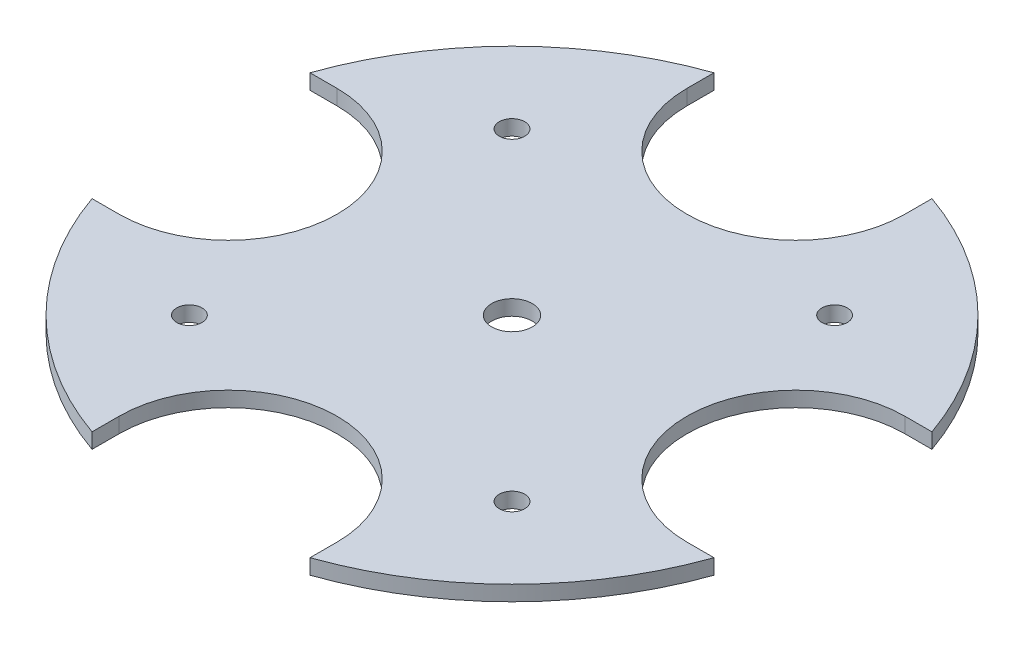
ISO-10303-21;
HEADER;
FILE_DESCRIPTION(('STEP AP214'),'2;1');
FILE_NAME('part.step','',(''),(''),'','','');
FILE_SCHEMA(('AUTOMOTIVE_DESIGN { 1 0 10303 214 1 1 1 1 }'));
ENDSEC;
DATA;
#1=APPLICATION_CONTEXT('core data for automotive mechanical design processes');
#2=APPLICATION_PROTOCOL_DEFINITION('international standard','automotive_design',2000,#1);
#3=PRODUCT_CONTEXT('',#1,'mechanical');
#4=PRODUCT('Part','Part','',(#3));
#5=PRODUCT_RELATED_PRODUCT_CATEGORY('part','',(#4));
#6=PRODUCT_DEFINITION_FORMATION('','',#4);
#7=PRODUCT_DEFINITION_CONTEXT('part definition',#1,'design');
#8=PRODUCT_DEFINITION('design','',#6,#7);
#9=PRODUCT_DEFINITION_SHAPE('','',#8);
#10=(LENGTH_UNIT() NAMED_UNIT(*) SI_UNIT(.MILLI.,.METRE.));
#11=(NAMED_UNIT(*) PLANE_ANGLE_UNIT() SI_UNIT($,.RADIAN.));
#12=(NAMED_UNIT(*) SI_UNIT($,.STERADIAN.) SOLID_ANGLE_UNIT());
#13=UNCERTAINTY_MEASURE_WITH_UNIT(LENGTH_MEASURE(1.E-05),#10,'distance_accuracy_value','');
#14=(GEOMETRIC_REPRESENTATION_CONTEXT(3) GLOBAL_UNCERTAINTY_ASSIGNED_CONTEXT((#13)) GLOBAL_UNIT_ASSIGNED_CONTEXT((#10,
#11,#12)) REPRESENTATION_CONTEXT('',''));
#15=CARTESIAN_POINT('',(0.,0.,0.));
#16=DIRECTION('',(0.,0.,1.));
#17=DIRECTION('',(1.,0.,0.));
#18=AXIS2_PLACEMENT_3D('',#15,#16,#17);
#19=CARTESIAN_POINT('',(-56.,3.,0.));
#20=DIRECTION('',(0.,1.,0.));
#21=DIRECTION('',(0.,0.,1.));
#22=AXIS2_PLACEMENT_3D('',#19,#20,#21);
#23=PLANE('',#22);
#24=CARTESIAN_POINT('',(31.8198051533946,3.,31.8198051533946));
#25=DIRECTION('',(0.,1.,0.));
#26=DIRECTION('',(0.,0.,1.));
#27=AXIS2_PLACEMENT_3D('',#24,#25,#26);
#28=CIRCLE('',#27,2.50000000000029);
#29=CARTESIAN_POINT('',(31.8198051533946,3.,34.3198051533949));
#30=VERTEX_POINT('',#29);
#31=EDGE_CURVE('E346',#30,#30,#28,.T.);
#32=ORIENTED_EDGE('',*,*,#31,.F.);
#33=EDGE_LOOP('',(#32));
#34=FACE_BOUND('',#33,.T.);
#35=CARTESIAN_POINT('',(-31.8198051533946,3.,-31.8198051533946));
#36=DIRECTION('',(0.,1.,0.));
#37=DIRECTION('',(0.,0.,1.));
#38=AXIS2_PLACEMENT_3D('',#35,#36,#37);
#39=CIRCLE('',#38,2.5);
#40=CARTESIAN_POINT('',(-31.8198051533946,3.,-29.3198051533946));
#41=VERTEX_POINT('',#40);
#42=EDGE_CURVE('E358',#41,#41,#39,.T.);
#43=ORIENTED_EDGE('',*,*,#42,.F.);
#44=EDGE_LOOP('',(#43));
#45=FACE_BOUND('',#44,.T.);
#46=CARTESIAN_POINT('',(-56.,3.,0.));
#47=DIRECTION('',(0.,-1.,0.));
#48=DIRECTION('',(0.,0.,1.));
#49=AXIS2_PLACEMENT_3D('',#46,#47,#48);
#50=CIRCLE('',#49,21.5);
#51=CARTESIAN_POINT('',(-56.0000000000001,3.,-21.5));
#52=VERTEX_POINT('',#51);
#53=CARTESIAN_POINT('',(-55.9999999999998,3.,21.5));
#54=VERTEX_POINT('',#53);
#55=EDGE_CURVE('E208',#52,#54,#50,.T.);
#56=ORIENTED_EDGE('',*,*,#55,.T.);
#57=DIRECTION('',(-1.,0.,0.));
#58=VECTOR('',#57,1.);
#59=CARTESIAN_POINT('',(-55.9999999999998,3.,21.5));
#60=LINE('',#59,#58);
#61=CARTESIAN_POINT('',(-61.3412585459412,3.,21.5));
#62=VERTEX_POINT('',#61);
#63=EDGE_CURVE('E116',#54,#62,#60,.T.);
#64=ORIENTED_EDGE('',*,*,#63,.T.);
#65=CARTESIAN_POINT('',(0.,3.,0.));
#66=DIRECTION('',(0.,1.,0.));
#67=DIRECTION('',(0.,0.,1.));
#68=AXIS2_PLACEMENT_3D('',#65,#66,#67);
#69=CIRCLE('',#68,65.);
#70=CARTESIAN_POINT('',(-21.5000000000007,3.,61.3412585459409));
#71=VERTEX_POINT('',#70);
#72=EDGE_CURVE('E247',#62,#71,#69,.T.);
#73=ORIENTED_EDGE('',*,*,#72,.T.);
#74=DIRECTION('',(0.,0.,-1.));
#75=VECTOR('',#74,1.);
#76=CARTESIAN_POINT('',(-21.5000000000006,3.,55.9999999999999));
#77=LINE('',#76,#75);
#78=CARTESIAN_POINT('',(-21.5000000000006,3.,55.9999999999999));
#79=VERTEX_POINT('',#78);
#80=EDGE_CURVE('E266',#71,#79,#77,.T.);
#81=ORIENTED_EDGE('',*,*,#80,.T.);
#82=CARTESIAN_POINT('',(-5.86568864925646E-13,3.,56.));
#83=DIRECTION('',(0.,-1.,0.));
#84=DIRECTION('',(0.,0.,1.));
#85=AXIS2_PLACEMENT_3D('',#82,#83,#84);
#86=CIRCLE('',#85,21.5);
#87=CARTESIAN_POINT('',(21.4999999999994,3.,56.));
#88=VERTEX_POINT('',#87);
#89=EDGE_CURVE('E263',#79,#88,#86,.T.);
#90=ORIENTED_EDGE('',*,*,#89,.T.);
#91=DIRECTION('',(0.,0.,1.));
#92=VECTOR('',#91,1.);
#93=CARTESIAN_POINT('',(21.4999999999994,3.,56.));
#94=LINE('',#93,#92);
#95=CARTESIAN_POINT('',(21.4999999999994,3.,61.3412585459414));
#96=VERTEX_POINT('',#95);
#97=EDGE_CURVE('E265',#88,#96,#94,.T.);
#98=ORIENTED_EDGE('',*,*,#97,.T.);
#99=CARTESIAN_POINT('',(0.,3.,0.));
#100=DIRECTION('',(0.,1.,0.));
#101=DIRECTION('',(0.,0.,1.));
#102=AXIS2_PLACEMENT_3D('',#99,#100,#101);
#103=CIRCLE('',#102,65.);
#104=CARTESIAN_POINT('',(61.341258545941,3.,21.5000000000005));
#105=VERTEX_POINT('',#104);
#106=EDGE_CURVE('E268',#96,#105,#103,.T.);
#107=ORIENTED_EDGE('',*,*,#106,.T.);
#108=DIRECTION('',(-1.,0.,0.));
#109=VECTOR('',#108,1.);
#110=CARTESIAN_POINT('',(55.9999999999999,3.,21.5000000000004));
#111=LINE('',#110,#109);
#112=CARTESIAN_POINT('',(56.,3.,21.5000000000004));
#113=VERTEX_POINT('',#112);
#114=EDGE_CURVE('E274',#105,#113,#111,.T.);
#115=ORIENTED_EDGE('',*,*,#114,.T.);
#116=CARTESIAN_POINT('',(56.,3.,3.91045909950431E-13));
#117=DIRECTION('',(0.,-1.,0.));
#118=DIRECTION('',(0.,0.,1.));
#119=AXIS2_PLACEMENT_3D('',#116,#117,#118);
#120=CIRCLE('',#119,21.5);
#121=CARTESIAN_POINT('',(55.9999999999999,3.,-21.4999999999996));
#122=VERTEX_POINT('',#121);
#123=EDGE_CURVE('E276',#113,#122,#120,.T.);
#124=ORIENTED_EDGE('',*,*,#123,.T.);
#125=DIRECTION('',(1.,0.,0.));
#126=VECTOR('',#125,1.);
#127=CARTESIAN_POINT('',(55.9999999999999,3.,-21.4999999999996));
#128=LINE('',#127,#126);
#129=CARTESIAN_POINT('',(61.3412585459413,3.,-21.4999999999996));
#130=VERTEX_POINT('',#129);
#131=EDGE_CURVE('E278',#122,#130,#128,.T.);
#132=ORIENTED_EDGE('',*,*,#131,.T.);
#133=CARTESIAN_POINT('',(0.,3.,0.));
#134=DIRECTION('',(0.,1.,0.));
#135=DIRECTION('',(0.,0.,1.));
#136=AXIS2_PLACEMENT_3D('',#133,#134,#135);
#137=CIRCLE('',#136,65.);
#138=CARTESIAN_POINT('',(21.5000000000002,3.,-61.3412585459411));
#139=VERTEX_POINT('',#138);
#140=EDGE_CURVE('E280',#130,#139,#137,.T.);
#141=ORIENTED_EDGE('',*,*,#140,.T.);
#142=DIRECTION('',(0.,0.,1.));
#143=VECTOR('',#142,1.);
#144=CARTESIAN_POINT('',(21.5000000000002,3.,-56.));
#145=LINE('',#144,#143);
#146=CARTESIAN_POINT('',(21.5000000000002,3.,-56.));
#147=VERTEX_POINT('',#146);
#148=EDGE_CURVE('E282',#139,#147,#145,.T.);
#149=ORIENTED_EDGE('',*,*,#148,.T.);
#150=CARTESIAN_POINT('',(1.95522954975215E-13,3.,-56.));
#151=DIRECTION('',(0.,-1.,0.));
#152=DIRECTION('',(0.,0.,1.));
#153=AXIS2_PLACEMENT_3D('',#150,#151,#152);
#154=CIRCLE('',#153,21.5);
#155=CARTESIAN_POINT('',(-21.4999999999998,3.,-55.9999999999999));
#156=VERTEX_POINT('',#155);
#157=EDGE_CURVE('E159',#147,#156,#154,.T.);
#158=ORIENTED_EDGE('',*,*,#157,.T.);
#159=DIRECTION('',(0.,0.,-1.));
#160=VECTOR('',#159,1.);
#161=CARTESIAN_POINT('',(-21.4999999999998,3.,-55.9999999999999));
#162=LINE('',#161,#160);
#163=CARTESIAN_POINT('',(-21.4999999999998,3.,-61.3412585459412));
#164=VERTEX_POINT('',#163);
#165=EDGE_CURVE('E153',#156,#164,#162,.T.);
#166=ORIENTED_EDGE('',*,*,#165,.T.);
#167=CARTESIAN_POINT('',(0.,3.,0.));
#168=DIRECTION('',(0.,1.,0.));
#169=DIRECTION('',(0.,0.,1.));
#170=AXIS2_PLACEMENT_3D('',#167,#168,#169);
#171=CIRCLE('',#170,65.);
#172=CARTESIAN_POINT('',(-61.3412585459412,3.,-21.5));
#173=VERTEX_POINT('',#172);
#174=EDGE_CURVE('E157',#164,#173,#171,.T.);
#175=ORIENTED_EDGE('',*,*,#174,.T.);
#176=DIRECTION('',(1.,0.,0.));
#177=VECTOR('',#176,1.);
#178=CARTESIAN_POINT('',(-56.0000000000001,3.,-21.5));
#179=LINE('',#178,#177);
#180=EDGE_CURVE('E49',#173,#52,#179,.T.);
#181=ORIENTED_EDGE('',*,*,#180,.T.);
#182=EDGE_LOOP('',(#56,#64,#73,#81,#90,#98,#107,#115,#124,#132,#141,#149,#158,#166,#175,#181));
#183=FACE_BOUND('',#182,.T.);
#184=CARTESIAN_POINT('',(0.,3.,0.));
#185=DIRECTION('',(0.,1.,0.));
#186=DIRECTION('',(0.,0.,1.));
#187=AXIS2_PLACEMENT_3D('',#184,#185,#186);
#188=CIRCLE('',#187,4.);
#189=CARTESIAN_POINT('',(0.,3.,4.));
#190=VERTEX_POINT('',#189);
#191=EDGE_CURVE('E181',#190,#190,#188,.T.);
#192=ORIENTED_EDGE('',*,*,#191,.F.);
#193=EDGE_LOOP('',(#192));
#194=FACE_BOUND('',#193,.T.);
#195=CARTESIAN_POINT('',(31.8198051533946,3.,-31.8198051533946));
#196=DIRECTION('',(0.,1.,0.));
#197=DIRECTION('',(0.,0.,1.));
#198=AXIS2_PLACEMENT_3D('',#195,#196,#197);
#199=CIRCLE('',#198,2.50000000000014);
#200=CARTESIAN_POINT('',(31.8198051533946,3.,-29.3198051533945));
#201=VERTEX_POINT('',#200);
#202=EDGE_CURVE('E352',#201,#201,#199,.T.);
#203=ORIENTED_EDGE('',*,*,#202,.F.);
#204=EDGE_LOOP('',(#203));
#205=FACE_BOUND('',#204,.T.);
#206=CARTESIAN_POINT('',(-31.8198051533946,3.,31.8198051533946));
#207=DIRECTION('',(0.,1.,0.));
#208=DIRECTION('',(0.,0.,1.));
#209=AXIS2_PLACEMENT_3D('',#206,#207,#208);
#210=CIRCLE('',#209,2.50000000000042);
#211=CARTESIAN_POINT('',(-31.8198051533946,3.,34.3198051533951));
#212=VERTEX_POINT('',#211);
#213=EDGE_CURVE('E337',#212,#212,#210,.T.);
#214=ORIENTED_EDGE('',*,*,#213,.F.);
#215=EDGE_LOOP('',(#214));
#216=FACE_BOUND('',#215,.T.);
#217=ADVANCED_FACE('F32',(#34,#45,#183,#194,#205,#216),#23,.T.);
#218=CARTESIAN_POINT('',(-56.,0.,0.));
#219=DIRECTION('',(0.,1.,0.));
#220=DIRECTION('',(0.,0.,1.));
#221=AXIS2_PLACEMENT_3D('',#218,#219,#220);
#222=PLANE('',#221);
#223=CARTESIAN_POINT('',(-56.,0.,0.));
#224=DIRECTION('',(0.,-1.,0.));
#225=DIRECTION('',(0.,0.,1.));
#226=AXIS2_PLACEMENT_3D('',#223,#224,#225);
#227=CIRCLE('',#226,21.5);
#228=CARTESIAN_POINT('',(-56.0000000000001,0.,-21.5));
#229=VERTEX_POINT('',#228);
#230=CARTESIAN_POINT('',(-55.9999999999998,0.,21.5));
#231=VERTEX_POINT('',#230);
#232=EDGE_CURVE('E177',#229,#231,#227,.T.);
#233=ORIENTED_EDGE('',*,*,#232,.F.);
#234=DIRECTION('',(1.,0.,0.));
#235=VECTOR('',#234,1.);
#236=CARTESIAN_POINT('',(-56.0000000000001,0.,-21.5));
#237=LINE('',#236,#235);
#238=CARTESIAN_POINT('',(-61.3412585459412,0.,-21.5));
#239=VERTEX_POINT('',#238);
#240=EDGE_CURVE('E108',#239,#229,#237,.T.);
#241=ORIENTED_EDGE('',*,*,#240,.F.);
#242=CARTESIAN_POINT('',(0.,0.,0.));
#243=DIRECTION('',(0.,1.,0.));
#244=DIRECTION('',(0.,0.,1.));
#245=AXIS2_PLACEMENT_3D('',#242,#243,#244);
#246=CIRCLE('',#245,65.);
#247=CARTESIAN_POINT('',(-21.4999999999998,0.,-61.3412585459412));
#248=VERTEX_POINT('',#247);
#249=EDGE_CURVE('E102',#248,#239,#246,.T.);
#250=ORIENTED_EDGE('',*,*,#249,.F.);
#251=DIRECTION('',(0.,0.,-1.));
#252=VECTOR('',#251,1.);
#253=CARTESIAN_POINT('',(-21.4999999999998,0.,-55.9999999999999));
#254=LINE('',#253,#252);
#255=CARTESIAN_POINT('',(-21.4999999999998,0.,-55.9999999999999));
#256=VERTEX_POINT('',#255);
#257=EDGE_CURVE('E167',#256,#248,#254,.T.);
#258=ORIENTED_EDGE('',*,*,#257,.F.);
#259=CARTESIAN_POINT('',(1.95522954975215E-13,0.,-56.));
#260=DIRECTION('',(0.,-1.,0.));
#261=DIRECTION('',(0.,0.,1.));
#262=AXIS2_PLACEMENT_3D('',#259,#260,#261);
#263=CIRCLE('',#262,21.5);
#264=CARTESIAN_POINT('',(21.5000000000002,0.,-56.));
#265=VERTEX_POINT('',#264);
#266=EDGE_CURVE('E203',#265,#256,#263,.T.);
#267=ORIENTED_EDGE('',*,*,#266,.F.);
#268=DIRECTION('',(0.,0.,1.));
#269=VECTOR('',#268,1.);
#270=CARTESIAN_POINT('',(21.5000000000002,0.,-56.));
#271=LINE('',#270,#269);
#272=CARTESIAN_POINT('',(21.5000000000002,0.,-61.3412585459411));
#273=VERTEX_POINT('',#272);
#274=EDGE_CURVE('E201',#273,#265,#271,.T.);
#275=ORIENTED_EDGE('',*,*,#274,.F.);
#276=CARTESIAN_POINT('',(0.,0.,0.));
#277=DIRECTION('',(0.,1.,0.));
#278=DIRECTION('',(0.,0.,1.));
#279=AXIS2_PLACEMENT_3D('',#276,#277,#278);
#280=CIRCLE('',#279,65.);
#281=CARTESIAN_POINT('',(61.3412585459413,0.,-21.4999999999996));
#282=VERTEX_POINT('',#281);
#283=EDGE_CURVE('E199',#282,#273,#280,.T.);
#284=ORIENTED_EDGE('',*,*,#283,.F.);
#285=DIRECTION('',(1.,0.,0.));
#286=VECTOR('',#285,1.);
#287=CARTESIAN_POINT('',(55.9999999999999,0.,-21.4999999999996));
#288=LINE('',#287,#286);
#289=CARTESIAN_POINT('',(55.9999999999999,0.,-21.4999999999996));
#290=VERTEX_POINT('',#289);
#291=EDGE_CURVE('E197',#290,#282,#288,.T.);
#292=ORIENTED_EDGE('',*,*,#291,.F.);
#293=CARTESIAN_POINT('',(56.,0.,3.91045909950431E-13));
#294=DIRECTION('',(0.,-1.,0.));
#295=DIRECTION('',(0.,0.,1.));
#296=AXIS2_PLACEMENT_3D('',#293,#294,#295);
#297=CIRCLE('',#296,21.5);
#298=CARTESIAN_POINT('',(56.,0.,21.5000000000004));
#299=VERTEX_POINT('',#298);
#300=EDGE_CURVE('E195',#299,#290,#297,.T.);
#301=ORIENTED_EDGE('',*,*,#300,.F.);
#302=DIRECTION('',(-1.,0.,0.));
#303=VECTOR('',#302,1.);
#304=CARTESIAN_POINT('',(55.9999999999999,0.,21.5000000000004));
#305=LINE('',#304,#303);
#306=CARTESIAN_POINT('',(61.341258545941,0.,21.5000000000005));
#307=VERTEX_POINT('',#306);
#308=EDGE_CURVE('E193',#307,#299,#305,.T.);
#309=ORIENTED_EDGE('',*,*,#308,.F.);
#310=CARTESIAN_POINT('',(0.,0.,0.));
#311=DIRECTION('',(0.,1.,0.));
#312=DIRECTION('',(0.,0.,1.));
#313=AXIS2_PLACEMENT_3D('',#310,#311,#312);
#314=CIRCLE('',#313,65.);
#315=CARTESIAN_POINT('',(21.4999999999994,0.,61.3412585459414));
#316=VERTEX_POINT('',#315);
#317=EDGE_CURVE('E191',#316,#307,#314,.T.);
#318=ORIENTED_EDGE('',*,*,#317,.F.);
#319=DIRECTION('',(0.,0.,1.));
#320=VECTOR('',#319,1.);
#321=CARTESIAN_POINT('',(21.4999999999994,0.,56.));
#322=LINE('',#321,#320);
#323=CARTESIAN_POINT('',(21.4999999999994,0.,56.));
#324=VERTEX_POINT('',#323);
#325=EDGE_CURVE('E189',#324,#316,#322,.T.);
#326=ORIENTED_EDGE('',*,*,#325,.F.);
#327=CARTESIAN_POINT('',(-5.86568864925646E-13,0.,56.));
#328=DIRECTION('',(0.,-1.,0.));
#329=DIRECTION('',(0.,0.,1.));
#330=AXIS2_PLACEMENT_3D('',#327,#328,#329);
#331=CIRCLE('',#330,21.5);
#332=CARTESIAN_POINT('',(-21.5000000000006,0.,55.9999999999999));
#333=VERTEX_POINT('',#332);
#334=EDGE_CURVE('E187',#333,#324,#331,.T.);
#335=ORIENTED_EDGE('',*,*,#334,.F.);
#336=DIRECTION('',(0.,0.,-1.));
#337=VECTOR('',#336,1.);
#338=CARTESIAN_POINT('',(-21.5000000000006,0.,55.9999999999999));
#339=LINE('',#338,#337);
#340=CARTESIAN_POINT('',(-21.5000000000007,0.,61.3412585459409));
#341=VERTEX_POINT('',#340);
#342=EDGE_CURVE('E185',#341,#333,#339,.T.);
#343=ORIENTED_EDGE('',*,*,#342,.F.);
#344=CARTESIAN_POINT('',(0.,0.,0.));
#345=DIRECTION('',(0.,1.,0.));
#346=DIRECTION('',(0.,0.,1.));
#347=AXIS2_PLACEMENT_3D('',#344,#345,#346);
#348=CIRCLE('',#347,65.);
#349=CARTESIAN_POINT('',(-61.3412585459412,0.,21.5));
#350=VERTEX_POINT('',#349);
#351=EDGE_CURVE('E183',#350,#341,#348,.T.);
#352=ORIENTED_EDGE('',*,*,#351,.F.);
#353=DIRECTION('',(-1.,0.,0.));
#354=VECTOR('',#353,1.);
#355=CARTESIAN_POINT('',(-55.9999999999998,0.,21.5));
#356=LINE('',#355,#354);
#357=EDGE_CURVE('E180',#231,#350,#356,.T.);
#358=ORIENTED_EDGE('',*,*,#357,.F.);
#359=EDGE_LOOP('',(#233,#241,#250,#258,#267,#275,#284,#292,#301,#309,#318,#326,#335,#343,#352,#358));
#360=FACE_BOUND('',#359,.T.);
#361=CARTESIAN_POINT('',(0.,0.,0.));
#362=DIRECTION('',(0.,1.,0.));
#363=DIRECTION('',(0.,0.,1.));
#364=AXIS2_PLACEMENT_3D('',#361,#362,#363);
#365=CIRCLE('',#364,4.);
#366=CARTESIAN_POINT('',(0.,0.,4.));
#367=VERTEX_POINT('',#366);
#368=EDGE_CURVE('E361',#367,#367,#365,.T.);
#369=ORIENTED_EDGE('',*,*,#368,.T.);
#370=EDGE_LOOP('',(#369));
#371=FACE_BOUND('',#370,.T.);
#372=CARTESIAN_POINT('',(-31.8198051533946,0.,-31.8198051533946));
#373=DIRECTION('',(0.,1.,0.));
#374=DIRECTION('',(0.,0.,1.));
#375=AXIS2_PLACEMENT_3D('',#372,#373,#374);
#376=CIRCLE('',#375,2.5);
#377=CARTESIAN_POINT('',(-31.8198051533946,0.,-29.3198051533946));
#378=VERTEX_POINT('',#377);
#379=EDGE_CURVE('E355',#378,#378,#376,.T.);
#380=ORIENTED_EDGE('',*,*,#379,.T.);
#381=EDGE_LOOP('',(#380));
#382=FACE_BOUND('',#381,.T.);
#383=CARTESIAN_POINT('',(31.8198051533946,0.,-31.8198051533946));
#384=DIRECTION('',(0.,1.,0.));
#385=DIRECTION('',(0.,0.,1.));
#386=AXIS2_PLACEMENT_3D('',#383,#384,#385);
#387=CIRCLE('',#386,2.50000000000014);
#388=CARTESIAN_POINT('',(31.8198051533946,0.,-29.3198051533945));
#389=VERTEX_POINT('',#388);
#390=EDGE_CURVE('E349',#389,#389,#387,.T.);
#391=ORIENTED_EDGE('',*,*,#390,.T.);
#392=EDGE_LOOP('',(#391));
#393=FACE_BOUND('',#392,.T.);
#394=CARTESIAN_POINT('',(31.8198051533946,0.,31.8198051533946));
#395=DIRECTION('',(0.,1.,0.));
#396=DIRECTION('',(0.,0.,1.));
#397=AXIS2_PLACEMENT_3D('',#394,#395,#396);
#398=CIRCLE('',#397,2.50000000000029);
#399=CARTESIAN_POINT('',(31.8198051533946,0.,34.3198051533949));
#400=VERTEX_POINT('',#399);
#401=EDGE_CURVE('E343',#400,#400,#398,.T.);
#402=ORIENTED_EDGE('',*,*,#401,.T.);
#403=EDGE_LOOP('',(#402));
#404=FACE_BOUND('',#403,.T.);
#405=CARTESIAN_POINT('',(-31.8198051533946,0.,31.8198051533946));
#406=DIRECTION('',(0.,1.,0.));
#407=DIRECTION('',(0.,0.,1.));
#408=AXIS2_PLACEMENT_3D('',#405,#406,#407);
#409=CIRCLE('',#408,2.50000000000042);
#410=CARTESIAN_POINT('',(-31.8198051533946,0.,34.3198051533951));
#411=VERTEX_POINT('',#410);
#412=EDGE_CURVE('E340',#411,#411,#409,.T.);
#413=ORIENTED_EDGE('',*,*,#412,.T.);
#414=EDGE_LOOP('',(#413));
#415=FACE_BOUND('',#414,.T.);
#416=ADVANCED_FACE('F251',(#360,#371,#382,#393,#404,#415),#222,.F.);
#417=CARTESIAN_POINT('',(-56.,3.,0.));
#418=DIRECTION('',(0.,-1.,0.));
#419=DIRECTION('',(0.,0.,-1.));
#420=AXIS2_PLACEMENT_3D('',#417,#418,#419);
#421=CYLINDRICAL_SURFACE('',#420,21.5);
#422=ORIENTED_EDGE('',*,*,#232,.T.);
#423=DIRECTION('',(0.,-1.,0.));
#424=VECTOR('',#423,1.);
#425=CARTESIAN_POINT('',(-55.9999999999998,3.,21.5));
#426=LINE('',#425,#424);
#427=EDGE_CURVE('E11',#54,#231,#426,.T.);
#428=ORIENTED_EDGE('',*,*,#427,.F.);
#429=ORIENTED_EDGE('',*,*,#55,.F.);
#430=DIRECTION('',(0.,-1.,0.));
#431=VECTOR('',#430,1.);
#432=CARTESIAN_POINT('',(-56.0000000000001,3.,-21.5));
#433=LINE('',#432,#431);
#434=EDGE_CURVE('E173',#52,#229,#433,.T.);
#435=ORIENTED_EDGE('',*,*,#434,.T.);
#436=EDGE_LOOP('',(#422,#428,#429,#435));
#437=FACE_BOUND('',#436,.T.);
#438=ADVANCED_FACE('F34',(#437),#421,.F.);
#439=CARTESIAN_POINT('',(-55.9999999999998,3.,21.5));
#440=DIRECTION('',(0.,0.,1.));
#441=DIRECTION('',(1.,0.,0.));
#442=AXIS2_PLACEMENT_3D('',#439,#440,#441);
#443=PLANE('',#442);
#444=ORIENTED_EDGE('',*,*,#357,.T.);
#445=DIRECTION('',(0.,-1.,0.));
#446=VECTOR('',#445,1.);
#447=CARTESIAN_POINT('',(-61.3412585459412,3.,21.5));
#448=LINE('',#447,#446);
#449=EDGE_CURVE('E41',#62,#350,#448,.T.);
#450=ORIENTED_EDGE('',*,*,#449,.F.);
#451=ORIENTED_EDGE('',*,*,#63,.F.);
#452=ORIENTED_EDGE('',*,*,#427,.T.);
#453=EDGE_LOOP('',(#444,#450,#451,#452));
#454=FACE_BOUND('',#453,.T.);
#455=ADVANCED_FACE('F520',(#454),#443,.F.);
#456=CARTESIAN_POINT('',(0.,3.,0.));
#457=DIRECTION('',(0.,-1.,0.));
#458=DIRECTION('',(0.,0.,-1.));
#459=AXIS2_PLACEMENT_3D('',#456,#457,#458);
#460=CYLINDRICAL_SURFACE('',#459,65.);
#461=ORIENTED_EDGE('',*,*,#351,.T.);
#462=DIRECTION('',(0.,-1.,0.));
#463=VECTOR('',#462,1.);
#464=CARTESIAN_POINT('',(-21.5000000000007,3.,61.3412585459409));
#465=LINE('',#464,#463);
#466=EDGE_CURVE('E239',#71,#341,#465,.T.);
#467=ORIENTED_EDGE('',*,*,#466,.F.);
#468=ORIENTED_EDGE('',*,*,#72,.F.);
#469=ORIENTED_EDGE('',*,*,#449,.T.);
#470=EDGE_LOOP('',(#461,#467,#468,#469));
#471=FACE_BOUND('',#470,.T.);
#472=ADVANCED_FACE('F245',(#471),#460,.T.);
#473=CARTESIAN_POINT('',(-21.5000000000006,3.,55.9999999999999));
#474=DIRECTION('',(-1.,0.,0.));
#475=DIRECTION('',(0.,0.,1.));
#476=AXIS2_PLACEMENT_3D('',#473,#474,#475);
#477=PLANE('',#476);
#478=ORIENTED_EDGE('',*,*,#342,.T.);
#479=DIRECTION('',(0.,-1.,0.));
#480=VECTOR('',#479,1.);
#481=CARTESIAN_POINT('',(-21.5000000000006,3.,55.9999999999999));
#482=LINE('',#481,#480);
#483=EDGE_CURVE('E236',#79,#333,#482,.T.);
#484=ORIENTED_EDGE('',*,*,#483,.F.);
#485=ORIENTED_EDGE('',*,*,#80,.F.);
#486=ORIENTED_EDGE('',*,*,#466,.T.);
#487=EDGE_LOOP('',(#478,#484,#485,#486));
#488=FACE_BOUND('',#487,.T.);
#489=ADVANCED_FACE('F257',(#488),#477,.F.);
#490=CARTESIAN_POINT('',(-5.86568864925646E-13,3.,56.));
#491=DIRECTION('',(0.,-1.,0.));
#492=DIRECTION('',(0.,0.,-1.));
#493=AXIS2_PLACEMENT_3D('',#490,#491,#492);
#494=CYLINDRICAL_SURFACE('',#493,21.5);
#495=ORIENTED_EDGE('',*,*,#334,.T.);
#496=DIRECTION('',(0.,-1.,0.));
#497=VECTOR('',#496,1.);
#498=CARTESIAN_POINT('',(21.4999999999994,3.,56.));
#499=LINE('',#498,#497);
#500=EDGE_CURVE('E233',#88,#324,#499,.T.);
#501=ORIENTED_EDGE('',*,*,#500,.F.);
#502=ORIENTED_EDGE('',*,*,#89,.F.);
#503=ORIENTED_EDGE('',*,*,#483,.T.);
#504=EDGE_LOOP('',(#495,#501,#502,#503));
#505=FACE_BOUND('',#504,.T.);
#506=ADVANCED_FACE('F261',(#505),#494,.F.);
#507=CARTESIAN_POINT('',(21.4999999999994,3.,56.));
#508=DIRECTION('',(1.,0.,0.));
#509=DIRECTION('',(0.,0.,-1.));
#510=AXIS2_PLACEMENT_3D('',#507,#508,#509);
#511=PLANE('',#510);
#512=ORIENTED_EDGE('',*,*,#325,.T.);
#513=DIRECTION('',(0.,-1.,0.));
#514=VECTOR('',#513,1.);
#515=CARTESIAN_POINT('',(21.4999999999994,3.,61.3412585459414));
#516=LINE('',#515,#514);
#517=EDGE_CURVE('E230',#96,#316,#516,.T.);
#518=ORIENTED_EDGE('',*,*,#517,.F.);
#519=ORIENTED_EDGE('',*,*,#97,.F.);
#520=ORIENTED_EDGE('',*,*,#500,.T.);
#521=EDGE_LOOP('',(#512,#518,#519,#520));
#522=FACE_BOUND('',#521,.T.);
#523=ADVANCED_FACE('F485',(#522),#511,.F.);
#524=CARTESIAN_POINT('',(0.,3.,0.));
#525=DIRECTION('',(0.,-1.,0.));
#526=DIRECTION('',(0.,0.,-1.));
#527=AXIS2_PLACEMENT_3D('',#524,#525,#526);
#528=CYLINDRICAL_SURFACE('',#527,65.);
#529=ORIENTED_EDGE('',*,*,#317,.T.);
#530=DIRECTION('',(0.,-1.,0.));
#531=VECTOR('',#530,1.);
#532=CARTESIAN_POINT('',(61.341258545941,3.,21.5000000000005));
#533=LINE('',#532,#531);
#534=EDGE_CURVE('E227',#105,#307,#533,.T.);
#535=ORIENTED_EDGE('',*,*,#534,.F.);
#536=ORIENTED_EDGE('',*,*,#106,.F.);
#537=ORIENTED_EDGE('',*,*,#517,.T.);
#538=EDGE_LOOP('',(#529,#535,#536,#537));
#539=FACE_BOUND('',#538,.T.);
#540=ADVANCED_FACE('F475',(#539),#528,.T.);
#541=CARTESIAN_POINT('',(55.9999999999999,3.,21.5000000000004));
#542=DIRECTION('',(0.,0.,1.));
#543=DIRECTION('',(1.,0.,0.));
#544=AXIS2_PLACEMENT_3D('',#541,#542,#543);
#545=PLANE('',#544);
#546=ORIENTED_EDGE('',*,*,#308,.T.);
#547=DIRECTION('',(0.,-1.,0.));
#548=VECTOR('',#547,1.);
#549=CARTESIAN_POINT('',(56.,3.,21.5000000000004));
#550=LINE('',#549,#548);
#551=EDGE_CURVE('E224',#113,#299,#550,.T.);
#552=ORIENTED_EDGE('',*,*,#551,.F.);
#553=ORIENTED_EDGE('',*,*,#114,.F.);
#554=ORIENTED_EDGE('',*,*,#534,.T.);
#555=EDGE_LOOP('',(#546,#552,#553,#554));
#556=FACE_BOUND('',#555,.T.);
#557=ADVANCED_FACE('F465',(#556),#545,.F.);
#558=CARTESIAN_POINT('',(56.,3.,3.91045909950431E-13));
#559=DIRECTION('',(0.,-1.,0.));
#560=DIRECTION('',(0.,0.,-1.));
#561=AXIS2_PLACEMENT_3D('',#558,#559,#560);
#562=CYLINDRICAL_SURFACE('',#561,21.5);
#563=ORIENTED_EDGE('',*,*,#300,.T.);
#564=DIRECTION('',(0.,-1.,0.));
#565=VECTOR('',#564,1.);
#566=CARTESIAN_POINT('',(55.9999999999999,3.,-21.4999999999996));
#567=LINE('',#566,#565);
#568=EDGE_CURVE('E221',#122,#290,#567,.T.);
#569=ORIENTED_EDGE('',*,*,#568,.F.);
#570=ORIENTED_EDGE('',*,*,#123,.F.);
#571=ORIENTED_EDGE('',*,*,#551,.T.);
#572=EDGE_LOOP('',(#563,#569,#570,#571));
#573=FACE_BOUND('',#572,.T.);
#574=ADVANCED_FACE('F455',(#573),#562,.F.);
#575=CARTESIAN_POINT('',(55.9999999999999,3.,-21.4999999999996));
#576=DIRECTION('',(0.,0.,-1.));
#577=DIRECTION('',(-1.,0.,0.));
#578=AXIS2_PLACEMENT_3D('',#575,#576,#577);
#579=PLANE('',#578);
#580=ORIENTED_EDGE('',*,*,#291,.T.);
#581=DIRECTION('',(0.,-1.,0.));
#582=VECTOR('',#581,1.);
#583=CARTESIAN_POINT('',(61.3412585459413,3.,-21.4999999999996));
#584=LINE('',#583,#582);
#585=EDGE_CURVE('E218',#130,#282,#584,.T.);
#586=ORIENTED_EDGE('',*,*,#585,.F.);
#587=ORIENTED_EDGE('',*,*,#131,.F.);
#588=ORIENTED_EDGE('',*,*,#568,.T.);
#589=EDGE_LOOP('',(#580,#586,#587,#588));
#590=FACE_BOUND('',#589,.T.);
#591=ADVANCED_FACE('F445',(#590),#579,.F.);
#592=CARTESIAN_POINT('',(0.,3.,0.));
#593=DIRECTION('',(0.,-1.,0.));
#594=DIRECTION('',(0.,0.,-1.));
#595=AXIS2_PLACEMENT_3D('',#592,#593,#594);
#596=CYLINDRICAL_SURFACE('',#595,65.);
#597=ORIENTED_EDGE('',*,*,#283,.T.);
#598=DIRECTION('',(0.,-1.,0.));
#599=VECTOR('',#598,1.);
#600=CARTESIAN_POINT('',(21.5000000000002,3.,-61.3412585459411));
#601=LINE('',#600,#599);
#602=EDGE_CURVE('E215',#139,#273,#601,.T.);
#603=ORIENTED_EDGE('',*,*,#602,.F.);
#604=ORIENTED_EDGE('',*,*,#140,.F.);
#605=ORIENTED_EDGE('',*,*,#585,.T.);
#606=EDGE_LOOP('',(#597,#603,#604,#605));
#607=FACE_BOUND('',#606,.T.);
#608=ADVANCED_FACE('F436',(#607),#596,.T.);
#609=CARTESIAN_POINT('',(21.5000000000002,3.,-56.));
#610=DIRECTION('',(1.,0.,0.));
#611=DIRECTION('',(0.,0.,-1.));
#612=AXIS2_PLACEMENT_3D('',#609,#610,#611);
#613=PLANE('',#612);
#614=ORIENTED_EDGE('',*,*,#274,.T.);
#615=DIRECTION('',(0.,-1.,0.));
#616=VECTOR('',#615,1.);
#617=CARTESIAN_POINT('',(21.5000000000002,3.,-56.));
#618=LINE('',#617,#616);
#619=EDGE_CURVE('E212',#147,#265,#618,.T.);
#620=ORIENTED_EDGE('',*,*,#619,.F.);
#621=ORIENTED_EDGE('',*,*,#148,.F.);
#622=ORIENTED_EDGE('',*,*,#602,.T.);
#623=EDGE_LOOP('',(#614,#620,#621,#622));
#624=FACE_BOUND('',#623,.T.);
#625=ADVANCED_FACE('F288',(#624),#613,.F.);
#626=CARTESIAN_POINT('',(1.95522954975215E-13,3.,-56.));
#627=DIRECTION('',(0.,-1.,0.));
#628=DIRECTION('',(0.,0.,-1.));
#629=AXIS2_PLACEMENT_3D('',#626,#627,#628);
#630=CYLINDRICAL_SURFACE('',#629,21.5);
#631=ORIENTED_EDGE('',*,*,#266,.T.);
#632=DIRECTION('',(0.,-1.,0.));
#633=VECTOR('',#632,1.);
#634=CARTESIAN_POINT('',(-21.4999999999998,3.,-55.9999999999999));
#635=LINE('',#634,#633);
#636=EDGE_CURVE('E168',#156,#256,#635,.T.);
#637=ORIENTED_EDGE('',*,*,#636,.F.);
#638=ORIENTED_EDGE('',*,*,#157,.F.);
#639=ORIENTED_EDGE('',*,*,#619,.T.);
#640=EDGE_LOOP('',(#631,#637,#638,#639));
#641=FACE_BOUND('',#640,.T.);
#642=ADVANCED_FACE('F292',(#641),#630,.F.);
#643=CARTESIAN_POINT('',(-21.4999999999998,3.,-55.9999999999999));
#644=DIRECTION('',(-1.,0.,0.));
#645=DIRECTION('',(0.,0.,1.));
#646=AXIS2_PLACEMENT_3D('',#643,#644,#645);
#647=PLANE('',#646);
#648=ORIENTED_EDGE('',*,*,#257,.T.);
#649=DIRECTION('',(0.,-1.,0.));
#650=VECTOR('',#649,1.);
#651=CARTESIAN_POINT('',(-21.4999999999998,3.,-61.3412585459412));
#652=LINE('',#651,#650);
#653=EDGE_CURVE('E164',#164,#248,#652,.T.);
#654=ORIENTED_EDGE('',*,*,#653,.F.);
#655=ORIENTED_EDGE('',*,*,#165,.F.);
#656=ORIENTED_EDGE('',*,*,#636,.T.);
#657=EDGE_LOOP('',(#648,#654,#655,#656));
#658=FACE_BOUND('',#657,.T.);
#659=ADVANCED_FACE('F165',(#658),#647,.F.);
#660=CARTESIAN_POINT('',(0.,3.,0.));
#661=DIRECTION('',(0.,-1.,0.));
#662=DIRECTION('',(0.,0.,-1.));
#663=AXIS2_PLACEMENT_3D('',#660,#661,#662);
#664=CYLINDRICAL_SURFACE('',#663,65.);
#665=ORIENTED_EDGE('',*,*,#249,.T.);
#666=DIRECTION('',(0.,-1.,0.));
#667=VECTOR('',#666,1.);
#668=CARTESIAN_POINT('',(-61.3412585459412,3.,-21.5));
#669=LINE('',#668,#667);
#670=EDGE_CURVE('E169',#173,#239,#669,.T.);
#671=ORIENTED_EDGE('',*,*,#670,.F.);
#672=ORIENTED_EDGE('',*,*,#174,.F.);
#673=ORIENTED_EDGE('',*,*,#653,.T.);
#674=EDGE_LOOP('',(#665,#671,#672,#673));
#675=FACE_BOUND('',#674,.T.);
#676=ADVANCED_FACE('F171',(#675),#664,.T.);
#677=CARTESIAN_POINT('',(-56.0000000000001,3.,-21.5));
#678=DIRECTION('',(0.,0.,-1.));
#679=DIRECTION('',(-1.,0.,0.));
#680=AXIS2_PLACEMENT_3D('',#677,#678,#679);
#681=PLANE('',#680);
#682=ORIENTED_EDGE('',*,*,#240,.T.);
#683=ORIENTED_EDGE('',*,*,#434,.F.);
#684=ORIENTED_EDGE('',*,*,#180,.F.);
#685=ORIENTED_EDGE('',*,*,#670,.T.);
#686=EDGE_LOOP('',(#682,#683,#684,#685));
#687=FACE_BOUND('',#686,.T.);
#688=ADVANCED_FACE('F296',(#687),#681,.F.);
#689=CARTESIAN_POINT('',(0.,3.,0.));
#690=DIRECTION('',(0.,-1.,0.));
#691=DIRECTION('',(0.,0.,-1.));
#692=AXIS2_PLACEMENT_3D('',#689,#690,#691);
#693=CYLINDRICAL_SURFACE('',#692,4.);
#694=ORIENTED_EDGE('',*,*,#191,.T.);
#695=EDGE_LOOP('',(#694));
#696=FACE_BOUND('',#695,.T.);
#697=ORIENTED_EDGE('',*,*,#368,.F.);
#698=EDGE_LOOP('',(#697));
#699=FACE_BOUND('',#698,.T.);
#700=ADVANCED_FACE('F298',(#696,#699),#693,.F.);
#701=CARTESIAN_POINT('',(-31.8198051533946,3.,-31.8198051533946));
#702=DIRECTION('',(0.,-1.,0.));
#703=DIRECTION('',(0.,0.,-1.));
#704=AXIS2_PLACEMENT_3D('',#701,#702,#703);
#705=CYLINDRICAL_SURFACE('',#704,2.5);
#706=ORIENTED_EDGE('',*,*,#42,.T.);
#707=EDGE_LOOP('',(#706));
#708=FACE_BOUND('',#707,.T.);
#709=ORIENTED_EDGE('',*,*,#379,.F.);
#710=EDGE_LOOP('',(#709));
#711=FACE_BOUND('',#710,.T.);
#712=ADVANCED_FACE('F304',(#708,#711),#705,.F.);
#713=CARTESIAN_POINT('',(31.8198051533946,3.,-31.8198051533946));
#714=DIRECTION('',(0.,-1.,0.));
#715=DIRECTION('',(0.,0.,-1.));
#716=AXIS2_PLACEMENT_3D('',#713,#714,#715);
#717=CYLINDRICAL_SURFACE('',#716,2.50000000000014);
#718=ORIENTED_EDGE('',*,*,#202,.T.);
#719=EDGE_LOOP('',(#718));
#720=FACE_BOUND('',#719,.T.);
#721=ORIENTED_EDGE('',*,*,#390,.F.);
#722=EDGE_LOOP('',(#721));
#723=FACE_BOUND('',#722,.T.);
#724=ADVANCED_FACE('F320',(#720,#723),#717,.F.);
#725=CARTESIAN_POINT('',(31.8198051533946,3.,31.8198051533946));
#726=DIRECTION('',(0.,-1.,0.));
#727=DIRECTION('',(0.,0.,-1.));
#728=AXIS2_PLACEMENT_3D('',#725,#726,#727);
#729=CYLINDRICAL_SURFACE('',#728,2.50000000000029);
#730=ORIENTED_EDGE('',*,*,#31,.T.);
#731=EDGE_LOOP('',(#730));
#732=FACE_BOUND('',#731,.T.);
#733=ORIENTED_EDGE('',*,*,#401,.F.);
#734=EDGE_LOOP('',(#733));
#735=FACE_BOUND('',#734,.T.);
#736=ADVANCED_FACE('F324',(#732,#735),#729,.F.);
#737=CARTESIAN_POINT('',(-31.8198051533946,3.,31.8198051533946));
#738=DIRECTION('',(0.,-1.,0.));
#739=DIRECTION('',(0.,0.,-1.));
#740=AXIS2_PLACEMENT_3D('',#737,#738,#739);
#741=CYLINDRICAL_SURFACE('',#740,2.50000000000042);
#742=ORIENTED_EDGE('',*,*,#213,.T.);
#743=EDGE_LOOP('',(#742));
#744=FACE_BOUND('',#743,.T.);
#745=ORIENTED_EDGE('',*,*,#412,.F.);
#746=EDGE_LOOP('',(#745));
#747=FACE_BOUND('',#746,.T.);
#748=ADVANCED_FACE('F328',(#744,#747),#741,.F.);
#749=CLOSED_SHELL('',(#217,#416,#438,#455,#472,#489,#506,#523,#540,#557,#574,#591,#608,#625,
#642,#659,#676,#688,#700,#712,#724,#736,#748));
#750=MANIFOLD_SOLID_BREP('B2',#749);
#751=ADVANCED_BREP_SHAPE_REPRESENTATION('',(#18,#750),#14);
#752=SHAPE_DEFINITION_REPRESENTATION(#9,#751);
ENDSEC;
END-ISO-10303-21;
